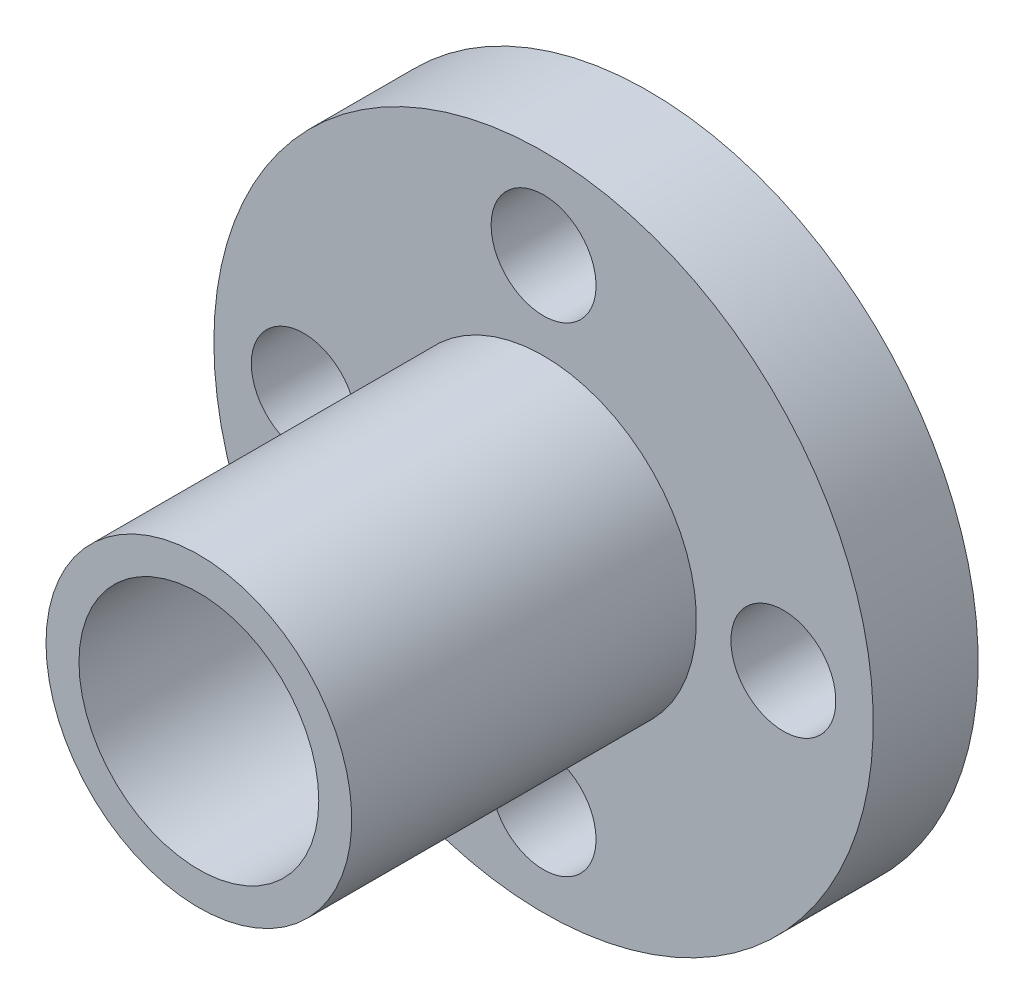
ISO-10303-21;
HEADER;
FILE_DESCRIPTION(('STEP AP214'),'2;1');
FILE_NAME('part.step','',(''),(''),'','','');
FILE_SCHEMA(('AUTOMOTIVE_DESIGN { 1 0 10303 214 1 1 1 1 }'));
ENDSEC;
DATA;
#1=APPLICATION_CONTEXT('core data for automotive mechanical design processes');
#2=APPLICATION_PROTOCOL_DEFINITION('international standard','automotive_design',2000,#1);
#3=PRODUCT_CONTEXT('',#1,'mechanical');
#4=PRODUCT('Part','Part','',(#3));
#5=PRODUCT_RELATED_PRODUCT_CATEGORY('part','',(#4));
#6=PRODUCT_DEFINITION_FORMATION('','',#4);
#7=PRODUCT_DEFINITION_CONTEXT('part definition',#1,'design');
#8=PRODUCT_DEFINITION('design','',#6,#7);
#9=PRODUCT_DEFINITION_SHAPE('','',#8);
#10=(LENGTH_UNIT() NAMED_UNIT(*) SI_UNIT(.MILLI.,.METRE.));
#11=(NAMED_UNIT(*) PLANE_ANGLE_UNIT() SI_UNIT($,.RADIAN.));
#12=(NAMED_UNIT(*) SI_UNIT($,.STERADIAN.) SOLID_ANGLE_UNIT());
#13=UNCERTAINTY_MEASURE_WITH_UNIT(LENGTH_MEASURE(1.E-05),#10,'distance_accuracy_value','');
#14=(GEOMETRIC_REPRESENTATION_CONTEXT(3) GLOBAL_UNCERTAINTY_ASSIGNED_CONTEXT((#13)) GLOBAL_UNIT_ASSIGNED_CONTEXT((#10,
#11,#12)) REPRESENTATION_CONTEXT('',''));
#15=CARTESIAN_POINT('',(0.,0.,0.));
#16=DIRECTION('',(0.,0.,1.));
#17=DIRECTION('',(1.,0.,0.));
#18=AXIS2_PLACEMENT_3D('',#15,#16,#17);
#19=CARTESIAN_POINT('',(4.,0.,0.));
#20=DIRECTION('',(0.,0.,-1.));
#21=DIRECTION('',(-1.,0.,0.));
#22=AXIS2_PLACEMENT_3D('',#19,#20,#21);
#23=PLANE('',#22);
#24=CARTESIAN_POINT('',(0.,0.,0.));
#25=DIRECTION('',(0.,0.,-1.));
#26=DIRECTION('',(-1.,0.,0.));
#27=AXIS2_PLACEMENT_3D('',#24,#25,#26);
#28=CIRCLE('',#27,5.1);
#29=CARTESIAN_POINT('',(-5.1,0.,0.));
#30=VERTEX_POINT('',#29);
#31=EDGE_CURVE('E10',#30,#30,#28,.T.);
#32=ORIENTED_EDGE('',*,*,#31,.F.);
#33=EDGE_LOOP('',(#32));
#34=FACE_BOUND('',#33,.T.);
#35=CARTESIAN_POINT('',(0.,0.,0.));
#36=DIRECTION('',(0.,0.,-1.));
#37=DIRECTION('',(-1.,0.,0.));
#38=AXIS2_PLACEMENT_3D('',#35,#36,#37);
#39=CIRCLE('',#38,4.);
#40=CARTESIAN_POINT('',(-4.,0.,0.));
#41=VERTEX_POINT('',#40);
#42=EDGE_CURVE('E61',#41,#41,#39,.T.);
#43=ORIENTED_EDGE('',*,*,#42,.T.);
#44=EDGE_LOOP('',(#43));
#45=FACE_BOUND('',#44,.T.);
#46=ADVANCED_FACE('F39',(#34,#45),#23,.F.);
#47=CARTESIAN_POINT('',(0.,0.,-35.91743664921));
#48=DIRECTION('',(0.,0.,-1.));
#49=DIRECTION('',(-1.,0.,0.));
#50=AXIS2_PLACEMENT_3D('',#47,#48,#49);
#51=CYLINDRICAL_SURFACE('',#50,5.1);
#52=CARTESIAN_POINT('',(0.,0.,-11.5));
#53=DIRECTION('',(0.,0.,-1.));
#54=DIRECTION('',(-1.,0.,0.));
#55=AXIS2_PLACEMENT_3D('',#52,#53,#54);
#56=CIRCLE('',#55,5.1);
#57=CARTESIAN_POINT('',(-5.1,0.,-11.5));
#58=VERTEX_POINT('',#57);
#59=EDGE_CURVE('E45',#58,#58,#56,.T.);
#60=ORIENTED_EDGE('',*,*,#59,.F.);
#61=EDGE_LOOP('',(#60));
#62=FACE_BOUND('',#61,.T.);
#63=ORIENTED_EDGE('',*,*,#31,.T.);
#64=EDGE_LOOP('',(#63));
#65=FACE_BOUND('',#64,.T.);
#66=ADVANCED_FACE('F115',(#62,#65),#51,.T.);
#67=CARTESIAN_POINT('',(5.1,0.,-11.5));
#68=DIRECTION('',(0.,0.,-1.));
#69=DIRECTION('',(-1.,0.,0.));
#70=AXIS2_PLACEMENT_3D('',#67,#68,#69);
#71=PLANE('',#70);
#72=CARTESIAN_POINT('',(0.,8.,-11.5));
#73=DIRECTION('',(0.,0.,-1.));
#74=DIRECTION('',(-1.,0.,0.));
#75=AXIS2_PLACEMENT_3D('',#72,#73,#74);
#76=CIRCLE('',#75,1.75);
#77=CARTESIAN_POINT('',(-1.75,8.,-11.5));
#78=VERTEX_POINT('',#77);
#79=EDGE_CURVE('E64',#78,#78,#76,.T.);
#80=ORIENTED_EDGE('',*,*,#79,.T.);
#81=EDGE_LOOP('',(#80));
#82=FACE_BOUND('',#81,.T.);
#83=CARTESIAN_POINT('',(-8.00000000000023,2.25904099284255E-13,-11.5));
#84=DIRECTION('',(0.,0.,-1.));
#85=DIRECTION('',(-1.,0.,0.));
#86=AXIS2_PLACEMENT_3D('',#83,#84,#85);
#87=CIRCLE('',#86,1.75000000000018);
#88=CARTESIAN_POINT('',(-9.7500000000004,2.25904099284255E-13,-11.5));
#89=VERTEX_POINT('',#88);
#90=EDGE_CURVE('E67',#89,#89,#87,.T.);
#91=ORIENTED_EDGE('',*,*,#90,.T.);
#92=EDGE_LOOP('',(#91));
#93=FACE_BOUND('',#92,.T.);
#94=CARTESIAN_POINT('',(-4.51808198568511E-13,-8.,-11.5));
#95=DIRECTION('',(0.,0.,-1.));
#96=DIRECTION('',(-1.,0.,0.));
#97=AXIS2_PLACEMENT_3D('',#94,#95,#96);
#98=CIRCLE('',#97,1.75000000000049);
#99=CARTESIAN_POINT('',(-1.75000000000094,-8.,-11.5));
#100=VERTEX_POINT('',#99);
#101=EDGE_CURVE('E70',#100,#100,#98,.T.);
#102=ORIENTED_EDGE('',*,*,#101,.T.);
#103=EDGE_LOOP('',(#102));
#104=FACE_BOUND('',#103,.T.);
#105=CARTESIAN_POINT('',(7.99999999999977,-2.26883816723573E-13,-11.5));
#106=DIRECTION('',(0.,0.,-1.));
#107=DIRECTION('',(-1.,0.,0.));
#108=AXIS2_PLACEMENT_3D('',#105,#106,#107);
#109=CIRCLE('',#108,1.75000000000036);
#110=CARTESIAN_POINT('',(6.24999999999941,-2.26883816723573E-13,-11.5));
#111=VERTEX_POINT('',#110);
#112=EDGE_CURVE('E73',#111,#111,#109,.T.);
#113=ORIENTED_EDGE('',*,*,#112,.T.);
#114=EDGE_LOOP('',(#113));
#115=FACE_BOUND('',#114,.T.);
#116=CARTESIAN_POINT('',(0.,0.,-11.5));
#117=DIRECTION('',(0.,0.,-1.));
#118=DIRECTION('',(-1.,0.,0.));
#119=AXIS2_PLACEMENT_3D('',#116,#117,#118);
#120=CIRCLE('',#119,11.);
#121=CARTESIAN_POINT('',(-11.,0.,-11.5));
#122=VERTEX_POINT('',#121);
#123=EDGE_CURVE('E49',#122,#122,#120,.T.);
#124=ORIENTED_EDGE('',*,*,#123,.F.);
#125=EDGE_LOOP('',(#124));
#126=FACE_BOUND('',#125,.T.);
#127=ORIENTED_EDGE('',*,*,#59,.T.);
#128=EDGE_LOOP('',(#127));
#129=FACE_BOUND('',#128,.T.);
#130=ADVANCED_FACE('F110',(#82,#93,#104,#115,#126,#129),#71,.F.);
#131=CARTESIAN_POINT('',(0.,0.,-35.91743664921));
#132=DIRECTION('',(0.,0.,-1.));
#133=DIRECTION('',(-1.,0.,0.));
#134=AXIS2_PLACEMENT_3D('',#131,#132,#133);
#135=CYLINDRICAL_SURFACE('',#134,11.);
#136=CARTESIAN_POINT('',(0.,0.,-15.));
#137=DIRECTION('',(0.,0.,-1.));
#138=DIRECTION('',(-1.,0.,0.));
#139=AXIS2_PLACEMENT_3D('',#136,#137,#138);
#140=CIRCLE('',#139,11.);
#141=CARTESIAN_POINT('',(-11.,0.,-15.));
#142=VERTEX_POINT('',#141);
#143=EDGE_CURVE('E53',#142,#142,#140,.T.);
#144=ORIENTED_EDGE('',*,*,#143,.F.);
#145=EDGE_LOOP('',(#144));
#146=FACE_BOUND('',#145,.T.);
#147=ORIENTED_EDGE('',*,*,#123,.T.);
#148=EDGE_LOOP('',(#147));
#149=FACE_BOUND('',#148,.T.);
#150=ADVANCED_FACE('F96',(#146,#149),#135,.T.);
#151=CARTESIAN_POINT('',(11.,0.,-15.));
#152=DIRECTION('',(0.,0.,1.));
#153=DIRECTION('',(1.,0.,0.));
#154=AXIS2_PLACEMENT_3D('',#151,#152,#153);
#155=PLANE('',#154);
#156=CARTESIAN_POINT('',(0.,8.,-15.));
#157=DIRECTION('',(0.,0.,-1.));
#158=DIRECTION('',(-1.,0.,0.));
#159=AXIS2_PLACEMENT_3D('',#156,#157,#158);
#160=CIRCLE('',#159,1.75);
#161=CARTESIAN_POINT('',(-1.75,8.,-15.));
#162=VERTEX_POINT('',#161);
#163=EDGE_CURVE('E76',#162,#162,#160,.T.);
#164=ORIENTED_EDGE('',*,*,#163,.F.);
#165=EDGE_LOOP('',(#164));
#166=FACE_BOUND('',#165,.T.);
#167=CARTESIAN_POINT('',(-8.00000000000023,2.25904099284255E-13,-15.));
#168=DIRECTION('',(0.,0.,-1.));
#169=DIRECTION('',(-1.,0.,0.));
#170=AXIS2_PLACEMENT_3D('',#167,#168,#169);
#171=CIRCLE('',#170,1.75000000000018);
#172=CARTESIAN_POINT('',(-9.7500000000004,2.25904099284255E-13,-15.));
#173=VERTEX_POINT('',#172);
#174=EDGE_CURVE('E83',#173,#173,#171,.T.);
#175=ORIENTED_EDGE('',*,*,#174,.F.);
#176=EDGE_LOOP('',(#175));
#177=FACE_BOUND('',#176,.T.);
#178=CARTESIAN_POINT('',(-4.51808198568511E-13,-8.,-15.));
#179=DIRECTION('',(0.,0.,-1.));
#180=DIRECTION('',(-1.,0.,0.));
#181=AXIS2_PLACEMENT_3D('',#178,#179,#180);
#182=CIRCLE('',#181,1.75000000000049);
#183=CARTESIAN_POINT('',(-1.75000000000094,-8.,-15.));
#184=VERTEX_POINT('',#183);
#185=EDGE_CURVE('E80',#184,#184,#182,.T.);
#186=ORIENTED_EDGE('',*,*,#185,.F.);
#187=EDGE_LOOP('',(#186));
#188=FACE_BOUND('',#187,.T.);
#189=CARTESIAN_POINT('',(7.99999999999977,-2.26883816723573E-13,-15.));
#190=DIRECTION('',(0.,0.,-1.));
#191=DIRECTION('',(-1.,0.,0.));
#192=AXIS2_PLACEMENT_3D('',#189,#190,#191);
#193=CIRCLE('',#192,1.75000000000036);
#194=CARTESIAN_POINT('',(6.24999999999941,-2.26883816723573E-13,-15.));
#195=VERTEX_POINT('',#194);
#196=EDGE_CURVE('E77',#195,#195,#193,.T.);
#197=ORIENTED_EDGE('',*,*,#196,.F.);
#198=EDGE_LOOP('',(#197));
#199=FACE_BOUND('',#198,.T.);
#200=CARTESIAN_POINT('',(0.,0.,-15.));
#201=DIRECTION('',(0.,0.,-1.));
#202=DIRECTION('',(-1.,0.,0.));
#203=AXIS2_PLACEMENT_3D('',#200,#201,#202);
#204=CIRCLE('',#203,4.);
#205=CARTESIAN_POINT('',(-4.,0.,-15.));
#206=VERTEX_POINT('',#205);
#207=EDGE_CURVE('E58',#206,#206,#204,.T.);
#208=ORIENTED_EDGE('',*,*,#207,.F.);
#209=EDGE_LOOP('',(#208));
#210=FACE_BOUND('',#209,.T.);
#211=ORIENTED_EDGE('',*,*,#143,.T.);
#212=EDGE_LOOP('',(#211));
#213=FACE_BOUND('',#212,.T.);
#214=ADVANCED_FACE('F92',(#166,#177,#188,#199,#210,#213),#155,.F.);
#215=CARTESIAN_POINT('',(0.,0.,-35.91743664921));
#216=DIRECTION('',(0.,0.,-1.));
#217=DIRECTION('',(-1.,0.,0.));
#218=AXIS2_PLACEMENT_3D('',#215,#216,#217);
#219=CYLINDRICAL_SURFACE('',#218,4.);
#220=ORIENTED_EDGE('',*,*,#42,.F.);
#221=EDGE_LOOP('',(#220));
#222=FACE_BOUND('',#221,.T.);
#223=ORIENTED_EDGE('',*,*,#207,.T.);
#224=EDGE_LOOP('',(#223));
#225=FACE_BOUND('',#224,.T.);
#226=ADVANCED_FACE('F95',(#222,#225),#219,.F.);
#227=CARTESIAN_POINT('',(7.99999999999977,-2.26883816723573E-13,0.));
#228=DIRECTION('',(0.,0.,-1.));
#229=DIRECTION('',(-1.,0.,0.));
#230=AXIS2_PLACEMENT_3D('',#227,#228,#229);
#231=CYLINDRICAL_SURFACE('',#230,1.75000000000036);
#232=ORIENTED_EDGE('',*,*,#196,.T.);
#233=EDGE_LOOP('',(#232));
#234=FACE_BOUND('',#233,.T.);
#235=ORIENTED_EDGE('',*,*,#112,.F.);
#236=EDGE_LOOP('',(#235));
#237=FACE_BOUND('',#236,.T.);
#238=ADVANCED_FACE('F132',(#234,#237),#231,.F.);
#239=CARTESIAN_POINT('',(-4.51808198568511E-13,-8.,0.));
#240=DIRECTION('',(0.,0.,-1.));
#241=DIRECTION('',(-1.,0.,0.));
#242=AXIS2_PLACEMENT_3D('',#239,#240,#241);
#243=CYLINDRICAL_SURFACE('',#242,1.75000000000049);
#244=ORIENTED_EDGE('',*,*,#185,.T.);
#245=EDGE_LOOP('',(#244));
#246=FACE_BOUND('',#245,.T.);
#247=ORIENTED_EDGE('',*,*,#101,.F.);
#248=EDGE_LOOP('',(#247));
#249=FACE_BOUND('',#248,.T.);
#250=ADVANCED_FACE('F137',(#246,#249),#243,.F.);
#251=CARTESIAN_POINT('',(-8.00000000000023,2.25904099284255E-13,0.));
#252=DIRECTION('',(0.,0.,-1.));
#253=DIRECTION('',(-1.,0.,0.));
#254=AXIS2_PLACEMENT_3D('',#251,#252,#253);
#255=CYLINDRICAL_SURFACE('',#254,1.75000000000018);
#256=ORIENTED_EDGE('',*,*,#174,.T.);
#257=EDGE_LOOP('',(#256));
#258=FACE_BOUND('',#257,.T.);
#259=ORIENTED_EDGE('',*,*,#90,.F.);
#260=EDGE_LOOP('',(#259));
#261=FACE_BOUND('',#260,.T.);
#262=ADVANCED_FACE('F143',(#258,#261),#255,.F.);
#263=CARTESIAN_POINT('',(0.,8.,0.));
#264=DIRECTION('',(0.,0.,-1.));
#265=DIRECTION('',(-1.,0.,0.));
#266=AXIS2_PLACEMENT_3D('',#263,#264,#265);
#267=CYLINDRICAL_SURFACE('',#266,1.75);
#268=ORIENTED_EDGE('',*,*,#163,.T.);
#269=EDGE_LOOP('',(#268));
#270=FACE_BOUND('',#269,.T.);
#271=ORIENTED_EDGE('',*,*,#79,.F.);
#272=EDGE_LOOP('',(#271));
#273=FACE_BOUND('',#272,.T.);
#274=ADVANCED_FACE('F89',(#270,#273),#267,.F.);
#275=CLOSED_SHELL('',(#46,#66,#130,#150,#214,#226,#238,#250,#262,#274));
#276=MANIFOLD_SOLID_BREP('B2',#275);
#277=ADVANCED_BREP_SHAPE_REPRESENTATION('',(#18,#276),#14);
#278=SHAPE_DEFINITION_REPRESENTATION(#9,#277);
ENDSEC;
END-ISO-10303-21;
